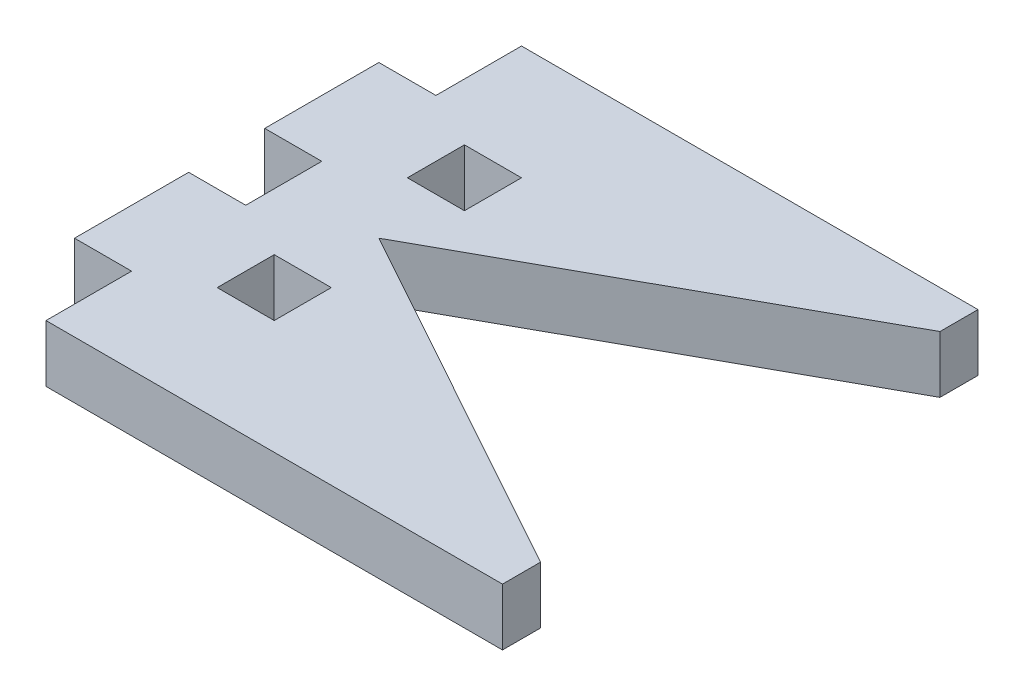
ISO-10303-21;
HEADER;
FILE_DESCRIPTION(('STEP AP214'),'2;1');
FILE_NAME('part.step','',(''),(''),'','','');
FILE_SCHEMA(('AUTOMOTIVE_DESIGN { 1 0 10303 214 1 1 1 1 }'));
ENDSEC;
DATA;
#1=APPLICATION_CONTEXT('core data for automotive mechanical design processes');
#2=APPLICATION_PROTOCOL_DEFINITION('international standard','automotive_design',2000,#1);
#3=PRODUCT_CONTEXT('',#1,'mechanical');
#4=PRODUCT('Part','Part','',(#3));
#5=PRODUCT_RELATED_PRODUCT_CATEGORY('part','',(#4));
#6=PRODUCT_DEFINITION_FORMATION('','',#4);
#7=PRODUCT_DEFINITION_CONTEXT('part definition',#1,'design');
#8=PRODUCT_DEFINITION('design','',#6,#7);
#9=PRODUCT_DEFINITION_SHAPE('','',#8);
#10=(LENGTH_UNIT() NAMED_UNIT(*) SI_UNIT(.MILLI.,.METRE.));
#11=(NAMED_UNIT(*) PLANE_ANGLE_UNIT() SI_UNIT($,.RADIAN.));
#12=(NAMED_UNIT(*) SI_UNIT($,.STERADIAN.) SOLID_ANGLE_UNIT());
#13=UNCERTAINTY_MEASURE_WITH_UNIT(LENGTH_MEASURE(1.E-05),#10,'distance_accuracy_value','');
#14=(GEOMETRIC_REPRESENTATION_CONTEXT(3) GLOBAL_UNCERTAINTY_ASSIGNED_CONTEXT((#13)) GLOBAL_UNIT_ASSIGNED_CONTEXT((#10,
#11,#12)) REPRESENTATION_CONTEXT('',''));
#15=CARTESIAN_POINT('',(0.,0.,0.));
#16=DIRECTION('',(0.,0.,1.));
#17=DIRECTION('',(1.,0.,0.));
#18=AXIS2_PLACEMENT_3D('',#15,#16,#17);
#19=CARTESIAN_POINT('',(13.5,3.,10.5));
#20=DIRECTION('',(-1.,0.,0.));
#21=DIRECTION('',(0.,0.,1.));
#22=AXIS2_PLACEMENT_3D('',#19,#20,#21);
#23=PLANE('',#22);
#24=DIRECTION('',(0.,0.,-1.));
#25=VECTOR('',#24,1.);
#26=CARTESIAN_POINT('',(13.5,0.,10.5));
#27=LINE('',#26,#25);
#28=CARTESIAN_POINT('',(13.5,0.,12.5));
#29=VERTEX_POINT('',#28);
#30=CARTESIAN_POINT('',(13.5,0.,10.5));
#31=VERTEX_POINT('',#30);
#32=EDGE_CURVE('E249',#29,#31,#27,.T.);
#33=ORIENTED_EDGE('',*,*,#32,.T.);
#34=DIRECTION('',(0.,-1.,0.));
#35=VECTOR('',#34,1.);
#36=CARTESIAN_POINT('',(13.5,3.,10.5));
#37=LINE('',#36,#35);
#38=CARTESIAN_POINT('',(13.5,3.,10.5));
#39=VERTEX_POINT('',#38);
#40=EDGE_CURVE('E11',#39,#31,#37,.T.);
#41=ORIENTED_EDGE('',*,*,#40,.F.);
#42=DIRECTION('',(0.,0.,-1.));
#43=VECTOR('',#42,1.);
#44=CARTESIAN_POINT('',(13.5,3.,10.5));
#45=LINE('',#44,#43);
#46=CARTESIAN_POINT('',(13.5,3.,12.5));
#47=VERTEX_POINT('',#46);
#48=EDGE_CURVE('E256',#47,#39,#45,.T.);
#49=ORIENTED_EDGE('',*,*,#48,.F.);
#50=DIRECTION('',(0.,-1.,0.));
#51=VECTOR('',#50,1.);
#52=CARTESIAN_POINT('',(13.5,3.,12.5));
#53=LINE('',#52,#51);
#54=EDGE_CURVE('E288',#47,#29,#53,.T.);
#55=ORIENTED_EDGE('',*,*,#54,.T.);
#56=EDGE_LOOP('',(#33,#41,#49,#55));
#57=FACE_BOUND('',#56,.T.);
#58=ADVANCED_FACE('F33',(#57),#23,.F.);
#59=CARTESIAN_POINT('',(-5.5,3.,0.));
#60=DIRECTION('',(-0.483686111690123,0.,0.87524153543927));
#61=DIRECTION('',(0.87524153543927,0.,0.483686111690123));
#62=AXIS2_PLACEMENT_3D('',#59,#60,#61);
#63=PLANE('',#62);
#64=DIRECTION('',(-0.87524153543927,0.,-0.483686111690123));
#65=VECTOR('',#64,1.);
#66=CARTESIAN_POINT('',(-5.5,0.,0.));
#67=LINE('',#66,#65);
#68=CARTESIAN_POINT('',(-5.5,0.,0.));
#69=VERTEX_POINT('',#68);
#70=EDGE_CURVE('E291',#31,#69,#67,.T.);
#71=ORIENTED_EDGE('',*,*,#70,.T.);
#72=DIRECTION('',(0.,-1.,0.));
#73=VECTOR('',#72,1.);
#74=CARTESIAN_POINT('',(-5.5,3.,0.));
#75=LINE('',#74,#73);
#76=CARTESIAN_POINT('',(-5.5,3.,0.));
#77=VERTEX_POINT('',#76);
#78=EDGE_CURVE('E40',#77,#69,#75,.T.);
#79=ORIENTED_EDGE('',*,*,#78,.F.);
#80=DIRECTION('',(-0.87524153543927,0.,-0.483686111690123));
#81=VECTOR('',#80,1.);
#82=CARTESIAN_POINT('',(-5.5,3.,0.));
#83=LINE('',#82,#81);
#84=EDGE_CURVE('E259',#39,#77,#83,.T.);
#85=ORIENTED_EDGE('',*,*,#84,.F.);
#86=ORIENTED_EDGE('',*,*,#40,.T.);
#87=EDGE_LOOP('',(#71,#79,#85,#86));
#88=FACE_BOUND('',#87,.T.);
#89=ADVANCED_FACE('F382',(#88),#63,.F.);
#90=CARTESIAN_POINT('',(-5.5,3.,0.));
#91=DIRECTION('',(-0.483686111690123,0.,-0.875241535439269));
#92=DIRECTION('',(-0.875241535439269,0.,0.483686111690123));
#93=AXIS2_PLACEMENT_3D('',#90,#91,#92);
#94=PLANE('',#93);
#95=DIRECTION('',(0.875241535439269,0.,-0.483686111690123));
#96=VECTOR('',#95,1.);
#97=CARTESIAN_POINT('',(-5.5,0.,0.));
#98=LINE('',#97,#96);
#99=CARTESIAN_POINT('',(13.5,0.,-10.5));
#100=VERTEX_POINT('',#99);
#101=EDGE_CURVE('E293',#69,#100,#98,.T.);
#102=ORIENTED_EDGE('',*,*,#101,.T.);
#103=DIRECTION('',(0.,-1.,0.));
#104=VECTOR('',#103,1.);
#105=CARTESIAN_POINT('',(13.5,3.,-10.5));
#106=LINE('',#105,#104);
#107=CARTESIAN_POINT('',(13.5,3.,-10.5));
#108=VERTEX_POINT('',#107);
#109=EDGE_CURVE('E353',#108,#100,#106,.T.);
#110=ORIENTED_EDGE('',*,*,#109,.F.);
#111=DIRECTION('',(0.875241535439269,0.,-0.483686111690123));
#112=VECTOR('',#111,1.);
#113=CARTESIAN_POINT('',(-5.5,3.,0.));
#114=LINE('',#113,#112);
#115=EDGE_CURVE('E262',#77,#108,#114,.T.);
#116=ORIENTED_EDGE('',*,*,#115,.F.);
#117=ORIENTED_EDGE('',*,*,#78,.T.);
#118=EDGE_LOOP('',(#102,#110,#116,#117));
#119=FACE_BOUND('',#118,.T.);
#120=ADVANCED_FACE('F360',(#119),#94,.F.);
#121=CARTESIAN_POINT('',(13.5,3.,-12.5));
#122=DIRECTION('',(-1.,0.,0.));
#123=DIRECTION('',(0.,0.,1.));
#124=AXIS2_PLACEMENT_3D('',#121,#122,#123);
#125=PLANE('',#124);
#126=DIRECTION('',(0.,0.,-1.));
#127=VECTOR('',#126,1.);
#128=CARTESIAN_POINT('',(13.5,0.,-12.5));
#129=LINE('',#128,#127);
#130=CARTESIAN_POINT('',(13.5,0.,-12.5));
#131=VERTEX_POINT('',#130);
#132=EDGE_CURVE('E295',#100,#131,#129,.T.);
#133=ORIENTED_EDGE('',*,*,#132,.T.);
#134=DIRECTION('',(0.,-1.,0.));
#135=VECTOR('',#134,1.);
#136=CARTESIAN_POINT('',(13.5,3.,-12.5));
#137=LINE('',#136,#135);
#138=CARTESIAN_POINT('',(13.5,3.,-12.5));
#139=VERTEX_POINT('',#138);
#140=EDGE_CURVE('E350',#139,#131,#137,.T.);
#141=ORIENTED_EDGE('',*,*,#140,.F.);
#142=DIRECTION('',(0.,0.,-1.));
#143=VECTOR('',#142,1.);
#144=CARTESIAN_POINT('',(13.5,3.,-12.5));
#145=LINE('',#144,#143);
#146=EDGE_CURVE('E264',#108,#139,#145,.T.);
#147=ORIENTED_EDGE('',*,*,#146,.F.);
#148=ORIENTED_EDGE('',*,*,#109,.T.);
#149=EDGE_LOOP('',(#133,#141,#147,#148));
#150=FACE_BOUND('',#149,.T.);
#151=ADVANCED_FACE('F370',(#150),#125,.F.);
#152=CARTESIAN_POINT('',(-10.5,3.,-12.5));
#153=DIRECTION('',(0.,0.,1.));
#154=DIRECTION('',(1.,0.,0.));
#155=AXIS2_PLACEMENT_3D('',#152,#153,#154);
#156=PLANE('',#155);
#157=DIRECTION('',(-1.,0.,0.));
#158=VECTOR('',#157,1.);
#159=CARTESIAN_POINT('',(-10.5,0.,-12.5));
#160=LINE('',#159,#158);
#161=CARTESIAN_POINT('',(-10.5,0.,-12.5));
#162=VERTEX_POINT('',#161);
#163=EDGE_CURVE('E297',#131,#162,#160,.T.);
#164=ORIENTED_EDGE('',*,*,#163,.T.);
#165=DIRECTION('',(0.,-1.,0.));
#166=VECTOR('',#165,1.);
#167=CARTESIAN_POINT('',(-10.5,3.,-12.5));
#168=LINE('',#167,#166);
#169=CARTESIAN_POINT('',(-10.5,3.,-12.5));
#170=VERTEX_POINT('',#169);
#171=EDGE_CURVE('E347',#170,#162,#168,.T.);
#172=ORIENTED_EDGE('',*,*,#171,.F.);
#173=DIRECTION('',(-1.,0.,0.));
#174=VECTOR('',#173,1.);
#175=CARTESIAN_POINT('',(-10.5,3.,-12.5));
#176=LINE('',#175,#174);
#177=EDGE_CURVE('E266',#139,#170,#176,.T.);
#178=ORIENTED_EDGE('',*,*,#177,.F.);
#179=ORIENTED_EDGE('',*,*,#140,.T.);
#180=EDGE_LOOP('',(#164,#172,#178,#179));
#181=FACE_BOUND('',#180,.T.);
#182=ADVANCED_FACE('F374',(#181),#156,.F.);
#183=CARTESIAN_POINT('',(-10.5,3.,-8.));
#184=DIRECTION('',(1.,0.,0.));
#185=DIRECTION('',(0.,0.,-1.));
#186=AXIS2_PLACEMENT_3D('',#183,#184,#185);
#187=PLANE('',#186);
#188=DIRECTION('',(0.,0.,1.));
#189=VECTOR('',#188,1.);
#190=CARTESIAN_POINT('',(-10.5,0.,-8.));
#191=LINE('',#190,#189);
#192=CARTESIAN_POINT('',(-10.5,0.,-8.));
#193=VERTEX_POINT('',#192);
#194=EDGE_CURVE('E299',#162,#193,#191,.T.);
#195=ORIENTED_EDGE('',*,*,#194,.T.);
#196=DIRECTION('',(0.,-1.,0.));
#197=VECTOR('',#196,1.);
#198=CARTESIAN_POINT('',(-10.5,3.,-8.));
#199=LINE('',#198,#197);
#200=CARTESIAN_POINT('',(-10.5,3.,-8.));
#201=VERTEX_POINT('',#200);
#202=EDGE_CURVE('E344',#201,#193,#199,.T.);
#203=ORIENTED_EDGE('',*,*,#202,.F.);
#204=DIRECTION('',(0.,0.,1.));
#205=VECTOR('',#204,1.);
#206=CARTESIAN_POINT('',(-10.5,3.,-8.));
#207=LINE('',#206,#205);
#208=EDGE_CURVE('E268',#170,#201,#207,.T.);
#209=ORIENTED_EDGE('',*,*,#208,.F.);
#210=ORIENTED_EDGE('',*,*,#171,.T.);
#211=EDGE_LOOP('',(#195,#203,#209,#210));
#212=FACE_BOUND('',#211,.T.);
#213=ADVANCED_FACE('F430',(#212),#187,.F.);
#214=CARTESIAN_POINT('',(-13.5,3.,-8.));
#215=DIRECTION('',(0.,0.,1.));
#216=DIRECTION('',(1.,0.,0.));
#217=AXIS2_PLACEMENT_3D('',#214,#215,#216);
#218=PLANE('',#217);
#219=DIRECTION('',(-1.,0.,0.));
#220=VECTOR('',#219,1.);
#221=CARTESIAN_POINT('',(-13.5,0.,-8.));
#222=LINE('',#221,#220);
#223=CARTESIAN_POINT('',(-13.5,0.,-8.));
#224=VERTEX_POINT('',#223);
#225=EDGE_CURVE('E301',#193,#224,#222,.T.);
#226=ORIENTED_EDGE('',*,*,#225,.T.);
#227=DIRECTION('',(0.,-1.,0.));
#228=VECTOR('',#227,1.);
#229=CARTESIAN_POINT('',(-13.5,3.,-8.));
#230=LINE('',#229,#228);
#231=CARTESIAN_POINT('',(-13.5,3.,-8.));
#232=VERTEX_POINT('',#231);
#233=EDGE_CURVE('E341',#232,#224,#230,.T.);
#234=ORIENTED_EDGE('',*,*,#233,.F.);
#235=DIRECTION('',(-1.,0.,0.));
#236=VECTOR('',#235,1.);
#237=CARTESIAN_POINT('',(-13.5,3.,-8.));
#238=LINE('',#237,#236);
#239=EDGE_CURVE('E270',#201,#232,#238,.T.);
#240=ORIENTED_EDGE('',*,*,#239,.F.);
#241=ORIENTED_EDGE('',*,*,#202,.T.);
#242=EDGE_LOOP('',(#226,#234,#240,#241));
#243=FACE_BOUND('',#242,.T.);
#244=ADVANCED_FACE('F428',(#243),#218,.F.);
#245=CARTESIAN_POINT('',(-13.5,3.,-8.));
#246=DIRECTION('',(1.,0.,0.));
#247=DIRECTION('',(0.,0.,-1.));
#248=AXIS2_PLACEMENT_3D('',#245,#246,#247);
#249=PLANE('',#248);
#250=DIRECTION('',(0.,0.,1.));
#251=VECTOR('',#250,1.);
#252=CARTESIAN_POINT('',(-13.5,0.,-8.));
#253=LINE('',#252,#251);
#254=CARTESIAN_POINT('',(-13.5,0.,-2.));
#255=VERTEX_POINT('',#254);
#256=EDGE_CURVE('E303',#224,#255,#253,.T.);
#257=ORIENTED_EDGE('',*,*,#256,.T.);
#258=DIRECTION('',(0.,-1.,0.));
#259=VECTOR('',#258,1.);
#260=CARTESIAN_POINT('',(-13.5,3.,-2.));
#261=LINE('',#260,#259);
#262=CARTESIAN_POINT('',(-13.5,3.,-2.));
#263=VERTEX_POINT('',#262);
#264=EDGE_CURVE('E338',#263,#255,#261,.T.);
#265=ORIENTED_EDGE('',*,*,#264,.F.);
#266=DIRECTION('',(0.,0.,1.));
#267=VECTOR('',#266,1.);
#268=CARTESIAN_POINT('',(-13.5,3.,-8.));
#269=LINE('',#268,#267);
#270=EDGE_CURVE('E272',#232,#263,#269,.T.);
#271=ORIENTED_EDGE('',*,*,#270,.F.);
#272=ORIENTED_EDGE('',*,*,#233,.T.);
#273=EDGE_LOOP('',(#257,#265,#271,#272));
#274=FACE_BOUND('',#273,.T.);
#275=ADVANCED_FACE('F424',(#274),#249,.F.);
#276=CARTESIAN_POINT('',(-13.5,3.,-2.));
#277=DIRECTION('',(0.,0.,-1.));
#278=DIRECTION('',(-1.,0.,0.));
#279=AXIS2_PLACEMENT_3D('',#276,#277,#278);
#280=PLANE('',#279);
#281=DIRECTION('',(1.,0.,0.));
#282=VECTOR('',#281,1.);
#283=CARTESIAN_POINT('',(-13.5,0.,-2.));
#284=LINE('',#283,#282);
#285=CARTESIAN_POINT('',(-10.5,0.,-2.));
#286=VERTEX_POINT('',#285);
#287=EDGE_CURVE('E305',#255,#286,#284,.T.);
#288=ORIENTED_EDGE('',*,*,#287,.T.);
#289=DIRECTION('',(0.,-1.,0.));
#290=VECTOR('',#289,1.);
#291=CARTESIAN_POINT('',(-10.5,3.,-2.));
#292=LINE('',#291,#290);
#293=CARTESIAN_POINT('',(-10.5,3.,-2.));
#294=VERTEX_POINT('',#293);
#295=EDGE_CURVE('E335',#294,#286,#292,.T.);
#296=ORIENTED_EDGE('',*,*,#295,.F.);
#297=DIRECTION('',(1.,0.,0.));
#298=VECTOR('',#297,1.);
#299=CARTESIAN_POINT('',(-13.5,3.,-2.));
#300=LINE('',#299,#298);
#301=EDGE_CURVE('E274',#263,#294,#300,.T.);
#302=ORIENTED_EDGE('',*,*,#301,.F.);
#303=ORIENTED_EDGE('',*,*,#264,.T.);
#304=EDGE_LOOP('',(#288,#296,#302,#303));
#305=FACE_BOUND('',#304,.T.);
#306=ADVANCED_FACE('F419',(#305),#280,.F.);
#307=CARTESIAN_POINT('',(-10.5,3.,-2.));
#308=DIRECTION('',(1.,0.,0.));
#309=DIRECTION('',(0.,0.,-1.));
#310=AXIS2_PLACEMENT_3D('',#307,#308,#309);
#311=PLANE('',#310);
#312=DIRECTION('',(0.,0.,1.));
#313=VECTOR('',#312,1.);
#314=CARTESIAN_POINT('',(-10.5,0.,-2.));
#315=LINE('',#314,#313);
#316=CARTESIAN_POINT('',(-10.5,0.,2.));
#317=VERTEX_POINT('',#316);
#318=EDGE_CURVE('E307',#286,#317,#315,.T.);
#319=ORIENTED_EDGE('',*,*,#318,.T.);
#320=DIRECTION('',(0.,-1.,0.));
#321=VECTOR('',#320,1.);
#322=CARTESIAN_POINT('',(-10.5,3.,2.));
#323=LINE('',#322,#321);
#324=CARTESIAN_POINT('',(-10.5,3.,2.));
#325=VERTEX_POINT('',#324);
#326=EDGE_CURVE('E332',#325,#317,#323,.T.);
#327=ORIENTED_EDGE('',*,*,#326,.F.);
#328=DIRECTION('',(0.,0.,1.));
#329=VECTOR('',#328,1.);
#330=CARTESIAN_POINT('',(-10.5,3.,-2.));
#331=LINE('',#330,#329);
#332=EDGE_CURVE('E276',#294,#325,#331,.T.);
#333=ORIENTED_EDGE('',*,*,#332,.F.);
#334=ORIENTED_EDGE('',*,*,#295,.T.);
#335=EDGE_LOOP('',(#319,#327,#333,#334));
#336=FACE_BOUND('',#335,.T.);
#337=ADVANCED_FACE('F413',(#336),#311,.F.);
#338=CARTESIAN_POINT('',(-13.5,3.,2.));
#339=DIRECTION('',(0.,0.,1.));
#340=DIRECTION('',(1.,0.,0.));
#341=AXIS2_PLACEMENT_3D('',#338,#339,#340);
#342=PLANE('',#341);
#343=DIRECTION('',(-1.,0.,0.));
#344=VECTOR('',#343,1.);
#345=CARTESIAN_POINT('',(-13.5,0.,2.));
#346=LINE('',#345,#344);
#347=CARTESIAN_POINT('',(-13.5,0.,2.));
#348=VERTEX_POINT('',#347);
#349=EDGE_CURVE('E309',#317,#348,#346,.T.);
#350=ORIENTED_EDGE('',*,*,#349,.T.);
#351=DIRECTION('',(0.,-1.,0.));
#352=VECTOR('',#351,1.);
#353=CARTESIAN_POINT('',(-13.5,3.,2.));
#354=LINE('',#353,#352);
#355=CARTESIAN_POINT('',(-13.5,3.,2.));
#356=VERTEX_POINT('',#355);
#357=EDGE_CURVE('E329',#356,#348,#354,.T.);
#358=ORIENTED_EDGE('',*,*,#357,.F.);
#359=DIRECTION('',(-1.,0.,0.));
#360=VECTOR('',#359,1.);
#361=CARTESIAN_POINT('',(-13.5,3.,2.));
#362=LINE('',#361,#360);
#363=EDGE_CURVE('E278',#325,#356,#362,.T.);
#364=ORIENTED_EDGE('',*,*,#363,.F.);
#365=ORIENTED_EDGE('',*,*,#326,.T.);
#366=EDGE_LOOP('',(#350,#358,#364,#365));
#367=FACE_BOUND('',#366,.T.);
#368=ADVANCED_FACE('F409',(#367),#342,.F.);
#369=CARTESIAN_POINT('',(-13.5,3.,2.));
#370=DIRECTION('',(1.,0.,0.));
#371=DIRECTION('',(0.,0.,-1.));
#372=AXIS2_PLACEMENT_3D('',#369,#370,#371);
#373=PLANE('',#372);
#374=DIRECTION('',(0.,0.,1.));
#375=VECTOR('',#374,1.);
#376=CARTESIAN_POINT('',(-13.5,0.,2.));
#377=LINE('',#376,#375);
#378=CARTESIAN_POINT('',(-13.5,0.,8.));
#379=VERTEX_POINT('',#378);
#380=EDGE_CURVE('E311',#348,#379,#377,.T.);
#381=ORIENTED_EDGE('',*,*,#380,.T.);
#382=DIRECTION('',(0.,-1.,0.));
#383=VECTOR('',#382,1.);
#384=CARTESIAN_POINT('',(-13.5,3.,8.));
#385=LINE('',#384,#383);
#386=CARTESIAN_POINT('',(-13.5,3.,8.));
#387=VERTEX_POINT('',#386);
#388=EDGE_CURVE('E326',#387,#379,#385,.T.);
#389=ORIENTED_EDGE('',*,*,#388,.F.);
#390=DIRECTION('',(0.,0.,1.));
#391=VECTOR('',#390,1.);
#392=CARTESIAN_POINT('',(-13.5,3.,2.));
#393=LINE('',#392,#391);
#394=EDGE_CURVE('E280',#356,#387,#393,.T.);
#395=ORIENTED_EDGE('',*,*,#394,.F.);
#396=ORIENTED_EDGE('',*,*,#357,.T.);
#397=EDGE_LOOP('',(#381,#389,#395,#396));
#398=FACE_BOUND('',#397,.T.);
#399=ADVANCED_FACE('F404',(#398),#373,.F.);
#400=CARTESIAN_POINT('',(-13.5,3.,8.));
#401=DIRECTION('',(0.,0.,-1.));
#402=DIRECTION('',(-1.,0.,0.));
#403=AXIS2_PLACEMENT_3D('',#400,#401,#402);
#404=PLANE('',#403);
#405=DIRECTION('',(1.,0.,0.));
#406=VECTOR('',#405,1.);
#407=CARTESIAN_POINT('',(-13.5,0.,8.));
#408=LINE('',#407,#406);
#409=CARTESIAN_POINT('',(-10.5,0.,8.));
#410=VERTEX_POINT('',#409);
#411=EDGE_CURVE('E313',#379,#410,#408,.T.);
#412=ORIENTED_EDGE('',*,*,#411,.T.);
#413=DIRECTION('',(0.,-1.,0.));
#414=VECTOR('',#413,1.);
#415=CARTESIAN_POINT('',(-10.5,3.,8.));
#416=LINE('',#415,#414);
#417=CARTESIAN_POINT('',(-10.5,3.,8.));
#418=VERTEX_POINT('',#417);
#419=EDGE_CURVE('E323',#418,#410,#416,.T.);
#420=ORIENTED_EDGE('',*,*,#419,.F.);
#421=DIRECTION('',(1.,0.,0.));
#422=VECTOR('',#421,1.);
#423=CARTESIAN_POINT('',(-13.5,3.,8.));
#424=LINE('',#423,#422);
#425=EDGE_CURVE('E282',#387,#418,#424,.T.);
#426=ORIENTED_EDGE('',*,*,#425,.F.);
#427=ORIENTED_EDGE('',*,*,#388,.T.);
#428=EDGE_LOOP('',(#412,#420,#426,#427));
#429=FACE_BOUND('',#428,.T.);
#430=ADVANCED_FACE('F398',(#429),#404,.F.);
#431=CARTESIAN_POINT('',(-10.5,3.,8.));
#432=DIRECTION('',(1.,0.,0.));
#433=DIRECTION('',(0.,0.,-1.));
#434=AXIS2_PLACEMENT_3D('',#431,#432,#433);
#435=PLANE('',#434);
#436=DIRECTION('',(0.,0.,1.));
#437=VECTOR('',#436,1.);
#438=CARTESIAN_POINT('',(-10.5,0.,8.));
#439=LINE('',#438,#437);
#440=CARTESIAN_POINT('',(-10.5,0.,12.5));
#441=VERTEX_POINT('',#440);
#442=EDGE_CURVE('E315',#410,#441,#439,.T.);
#443=ORIENTED_EDGE('',*,*,#442,.T.);
#444=DIRECTION('',(0.,-1.,0.));
#445=VECTOR('',#444,1.);
#446=CARTESIAN_POINT('',(-10.5,3.,12.5));
#447=LINE('',#446,#445);
#448=CARTESIAN_POINT('',(-10.5,3.,12.5));
#449=VERTEX_POINT('',#448);
#450=EDGE_CURVE('E320',#449,#441,#447,.T.);
#451=ORIENTED_EDGE('',*,*,#450,.F.);
#452=DIRECTION('',(0.,0.,1.));
#453=VECTOR('',#452,1.);
#454=CARTESIAN_POINT('',(-10.5,3.,8.));
#455=LINE('',#454,#453);
#456=EDGE_CURVE('E284',#418,#449,#455,.T.);
#457=ORIENTED_EDGE('',*,*,#456,.F.);
#458=ORIENTED_EDGE('',*,*,#419,.T.);
#459=EDGE_LOOP('',(#443,#451,#457,#458));
#460=FACE_BOUND('',#459,.T.);
#461=ADVANCED_FACE('F394',(#460),#435,.F.);
#462=CARTESIAN_POINT('',(-10.5,3.,12.5));
#463=DIRECTION('',(0.,0.,-1.));
#464=DIRECTION('',(-1.,0.,0.));
#465=AXIS2_PLACEMENT_3D('',#462,#463,#464);
#466=PLANE('',#465);
#467=DIRECTION('',(1.,0.,0.));
#468=VECTOR('',#467,1.);
#469=CARTESIAN_POINT('',(-10.5,0.,12.5));
#470=LINE('',#469,#468);
#471=EDGE_CURVE('E260',#441,#29,#470,.T.);
#472=ORIENTED_EDGE('',*,*,#471,.T.);
#473=ORIENTED_EDGE('',*,*,#54,.F.);
#474=DIRECTION('',(1.,0.,0.));
#475=VECTOR('',#474,1.);
#476=CARTESIAN_POINT('',(-10.5,3.,12.5));
#477=LINE('',#476,#475);
#478=EDGE_CURVE('E286',#449,#47,#477,.T.);
#479=ORIENTED_EDGE('',*,*,#478,.F.);
#480=ORIENTED_EDGE('',*,*,#450,.T.);
#481=EDGE_LOOP('',(#472,#473,#479,#480));
#482=FACE_BOUND('',#481,.T.);
#483=ADVANCED_FACE('F389',(#482),#466,.F.);
#484=CARTESIAN_POINT('',(0.,3.,0.));
#485=DIRECTION('',(0.,1.,0.));
#486=DIRECTION('',(0.,0.,1.));
#487=AXIS2_PLACEMENT_3D('',#484,#485,#486);
#488=PLANE('',#487);
#489=DIRECTION('',(-1.,0.,0.));
#490=VECTOR('',#489,1.);
#491=CARTESIAN_POINT('',(-7.5,3.,3.50000000000001));
#492=LINE('',#491,#490);
#493=CARTESIAN_POINT('',(-4.5,3.,3.5));
#494=VERTEX_POINT('',#493);
#495=CARTESIAN_POINT('',(-7.5,3.,3.50000000000001));
#496=VERTEX_POINT('',#495);
#497=EDGE_CURVE('E47',#494,#496,#492,.T.);
#498=ORIENTED_EDGE('',*,*,#497,.F.);
#499=DIRECTION('',(0.,0.,-1.));
#500=VECTOR('',#499,1.);
#501=CARTESIAN_POINT('',(-4.5,3.,3.5));
#502=LINE('',#501,#500);
#503=CARTESIAN_POINT('',(-4.5,3.,6.5));
#504=VERTEX_POINT('',#503);
#505=EDGE_CURVE('E205',#504,#494,#502,.T.);
#506=ORIENTED_EDGE('',*,*,#505,.F.);
#507=DIRECTION('',(1.,0.,0.));
#508=VECTOR('',#507,1.);
#509=CARTESIAN_POINT('',(-7.5,3.,6.50000000000001));
#510=LINE('',#509,#508);
#511=CARTESIAN_POINT('',(-7.5,3.,6.50000000000001));
#512=VERTEX_POINT('',#511);
#513=EDGE_CURVE('E208',#512,#504,#510,.T.);
#514=ORIENTED_EDGE('',*,*,#513,.F.);
#515=DIRECTION('',(0.,0.,1.));
#516=VECTOR('',#515,1.);
#517=CARTESIAN_POINT('',(-7.5,3.,3.50000000000001));
#518=LINE('',#517,#516);
#519=EDGE_CURVE('E214',#496,#512,#518,.T.);
#520=ORIENTED_EDGE('',*,*,#519,.F.);
#521=EDGE_LOOP('',(#498,#506,#514,#520));
#522=FACE_BOUND('',#521,.T.);
#523=DIRECTION('',(-1.,0.,0.));
#524=VECTOR('',#523,1.);
#525=CARTESIAN_POINT('',(-7.5,3.,-6.5));
#526=LINE('',#525,#524);
#527=CARTESIAN_POINT('',(-4.5,3.,-6.50000000000001));
#528=VERTEX_POINT('',#527);
#529=CARTESIAN_POINT('',(-7.5,3.,-6.5));
#530=VERTEX_POINT('',#529);
#531=EDGE_CURVE('E220',#528,#530,#526,.T.);
#532=ORIENTED_EDGE('',*,*,#531,.F.);
#533=DIRECTION('',(0.,0.,-1.));
#534=VECTOR('',#533,1.);
#535=CARTESIAN_POINT('',(-4.5,3.,-6.50000000000001));
#536=LINE('',#535,#534);
#537=CARTESIAN_POINT('',(-4.5,3.,-3.50000000000001));
#538=VERTEX_POINT('',#537);
#539=EDGE_CURVE('E228',#538,#528,#536,.T.);
#540=ORIENTED_EDGE('',*,*,#539,.F.);
#541=DIRECTION('',(1.,0.,0.));
#542=VECTOR('',#541,1.);
#543=CARTESIAN_POINT('',(-7.5,3.,-3.50000000000001));
#544=LINE('',#543,#542);
#545=CARTESIAN_POINT('',(-7.5,3.,-3.50000000000001));
#546=VERTEX_POINT('',#545);
#547=EDGE_CURVE('E242',#546,#538,#544,.T.);
#548=ORIENTED_EDGE('',*,*,#547,.F.);
#549=DIRECTION('',(0.,0.,1.));
#550=VECTOR('',#549,1.);
#551=CARTESIAN_POINT('',(-7.5,3.,-6.5));
#552=LINE('',#551,#550);
#553=EDGE_CURVE('E239',#530,#546,#552,.T.);
#554=ORIENTED_EDGE('',*,*,#553,.F.);
#555=EDGE_LOOP('',(#532,#540,#548,#554));
#556=FACE_BOUND('',#555,.T.);
#557=ORIENTED_EDGE('',*,*,#48,.T.);
#558=ORIENTED_EDGE('',*,*,#84,.T.);
#559=ORIENTED_EDGE('',*,*,#115,.T.);
#560=ORIENTED_EDGE('',*,*,#146,.T.);
#561=ORIENTED_EDGE('',*,*,#177,.T.);
#562=ORIENTED_EDGE('',*,*,#208,.T.);
#563=ORIENTED_EDGE('',*,*,#239,.T.);
#564=ORIENTED_EDGE('',*,*,#270,.T.);
#565=ORIENTED_EDGE('',*,*,#301,.T.);
#566=ORIENTED_EDGE('',*,*,#332,.T.);
#567=ORIENTED_EDGE('',*,*,#363,.T.);
#568=ORIENTED_EDGE('',*,*,#394,.T.);
#569=ORIENTED_EDGE('',*,*,#425,.T.);
#570=ORIENTED_EDGE('',*,*,#456,.T.);
#571=ORIENTED_EDGE('',*,*,#478,.T.);
#572=EDGE_LOOP('',(#557,#558,#559,#560,#561,#562,#563,#564,#565,#566,#567,#568,#569,#570,#571));
#573=FACE_BOUND('',#572,.T.);
#574=ADVANCED_FACE('F378',(#522,#556,#573),#488,.T.);
#575=CARTESIAN_POINT('',(0.,0.,0.));
#576=DIRECTION('',(0.,1.,0.));
#577=DIRECTION('',(0.,0.,1.));
#578=AXIS2_PLACEMENT_3D('',#575,#576,#577);
#579=PLANE('',#578);
#580=DIRECTION('',(0.,0.,-1.));
#581=VECTOR('',#580,1.);
#582=CARTESIAN_POINT('',(-4.5,0.,3.5));
#583=LINE('',#582,#581);
#584=CARTESIAN_POINT('',(-4.5,0.,6.5));
#585=VERTEX_POINT('',#584);
#586=CARTESIAN_POINT('',(-4.5,0.,3.5));
#587=VERTEX_POINT('',#586);
#588=EDGE_CURVE('E195',#585,#587,#583,.T.);
#589=ORIENTED_EDGE('',*,*,#588,.T.);
#590=DIRECTION('',(-1.,0.,0.));
#591=VECTOR('',#590,1.);
#592=CARTESIAN_POINT('',(-7.5,0.,3.50000000000001));
#593=LINE('',#592,#591);
#594=CARTESIAN_POINT('',(-7.5,0.,3.50000000000001));
#595=VERTEX_POINT('',#594);
#596=EDGE_CURVE('E189',#587,#595,#593,.T.);
#597=ORIENTED_EDGE('',*,*,#596,.T.);
#598=DIRECTION('',(0.,0.,1.));
#599=VECTOR('',#598,1.);
#600=CARTESIAN_POINT('',(-7.5,0.,3.50000000000001));
#601=LINE('',#600,#599);
#602=CARTESIAN_POINT('',(-7.5,0.,6.5));
#603=VERTEX_POINT('',#602);
#604=EDGE_CURVE('E198',#595,#603,#601,.T.);
#605=ORIENTED_EDGE('',*,*,#604,.T.);
#606=DIRECTION('',(1.,0.,0.));
#607=VECTOR('',#606,1.);
#608=CARTESIAN_POINT('',(-7.5,0.,6.50000000000001));
#609=LINE('',#608,#607);
#610=EDGE_CURVE('E55',#603,#585,#609,.T.);
#611=ORIENTED_EDGE('',*,*,#610,.T.);
#612=EDGE_LOOP('',(#589,#597,#605,#611));
#613=FACE_BOUND('',#612,.T.);
#614=DIRECTION('',(0.,0.,-1.));
#615=VECTOR('',#614,1.);
#616=CARTESIAN_POINT('',(-4.5,0.,-6.50000000000001));
#617=LINE('',#616,#615);
#618=CARTESIAN_POINT('',(-4.5,0.,-3.50000000000001));
#619=VERTEX_POINT('',#618);
#620=CARTESIAN_POINT('',(-4.5,0.,-6.50000000000001));
#621=VERTEX_POINT('',#620);
#622=EDGE_CURVE('E234',#619,#621,#617,.T.);
#623=ORIENTED_EDGE('',*,*,#622,.T.);
#624=DIRECTION('',(-1.,0.,0.));
#625=VECTOR('',#624,1.);
#626=CARTESIAN_POINT('',(-7.5,0.,-6.5));
#627=LINE('',#626,#625);
#628=CARTESIAN_POINT('',(-7.5,0.,-6.5));
#629=VERTEX_POINT('',#628);
#630=EDGE_CURVE('E224',#621,#629,#627,.T.);
#631=ORIENTED_EDGE('',*,*,#630,.T.);
#632=DIRECTION('',(0.,0.,1.));
#633=VECTOR('',#632,1.);
#634=CARTESIAN_POINT('',(-7.5,0.,-6.5));
#635=LINE('',#634,#633);
#636=CARTESIAN_POINT('',(-7.5,0.,-3.50000000000001));
#637=VERTEX_POINT('',#636);
#638=EDGE_CURVE('E227',#629,#637,#635,.T.);
#639=ORIENTED_EDGE('',*,*,#638,.T.);
#640=DIRECTION('',(1.,0.,0.));
#641=VECTOR('',#640,1.);
#642=CARTESIAN_POINT('',(-7.5,0.,-3.50000000000001));
#643=LINE('',#642,#641);
#644=EDGE_CURVE('E231',#637,#619,#643,.T.);
#645=ORIENTED_EDGE('',*,*,#644,.T.);
#646=EDGE_LOOP('',(#623,#631,#639,#645));
#647=FACE_BOUND('',#646,.T.);
#648=ORIENTED_EDGE('',*,*,#32,.F.);
#649=ORIENTED_EDGE('',*,*,#471,.F.);
#650=ORIENTED_EDGE('',*,*,#442,.F.);
#651=ORIENTED_EDGE('',*,*,#411,.F.);
#652=ORIENTED_EDGE('',*,*,#380,.F.);
#653=ORIENTED_EDGE('',*,*,#349,.F.);
#654=ORIENTED_EDGE('',*,*,#318,.F.);
#655=ORIENTED_EDGE('',*,*,#287,.F.);
#656=ORIENTED_EDGE('',*,*,#256,.F.);
#657=ORIENTED_EDGE('',*,*,#225,.F.);
#658=ORIENTED_EDGE('',*,*,#194,.F.);
#659=ORIENTED_EDGE('',*,*,#163,.F.);
#660=ORIENTED_EDGE('',*,*,#132,.F.);
#661=ORIENTED_EDGE('',*,*,#101,.F.);
#662=ORIENTED_EDGE('',*,*,#70,.F.);
#663=EDGE_LOOP('',(#648,#649,#650,#651,#652,#653,#654,#655,#656,#657,#658,#659,#660,#661,#662));
#664=FACE_BOUND('',#663,.T.);
#665=ADVANCED_FACE('F202',(#613,#647,#664),#579,.F.);
#666=CARTESIAN_POINT('',(-7.5,0.,-6.5));
#667=DIRECTION('',(0.,0.,-1.));
#668=DIRECTION('',(-1.,0.,0.));
#669=AXIS2_PLACEMENT_3D('',#666,#667,#668);
#670=PLANE('',#669);
#671=ORIENTED_EDGE('',*,*,#531,.T.);
#672=DIRECTION('',(0.,1.,0.));
#673=VECTOR('',#672,1.);
#674=CARTESIAN_POINT('',(-7.5,0.,-6.5));
#675=LINE('',#674,#673);
#676=EDGE_CURVE('E237',#629,#530,#675,.T.);
#677=ORIENTED_EDGE('',*,*,#676,.F.);
#678=ORIENTED_EDGE('',*,*,#630,.F.);
#679=DIRECTION('',(0.,1.,0.));
#680=VECTOR('',#679,1.);
#681=CARTESIAN_POINT('',(-4.5,0.,-6.50000000000001));
#682=LINE('',#681,#680);
#683=EDGE_CURVE('E247',#621,#528,#682,.T.);
#684=ORIENTED_EDGE('',*,*,#683,.T.);
#685=EDGE_LOOP('',(#671,#677,#678,#684));
#686=FACE_BOUND('',#685,.T.);
#687=ADVANCED_FACE('F546',(#686),#670,.F.);
#688=CARTESIAN_POINT('',(-4.5,0.,-6.50000000000001));
#689=DIRECTION('',(1.,0.,0.));
#690=DIRECTION('',(0.,0.,-1.));
#691=AXIS2_PLACEMENT_3D('',#688,#689,#690);
#692=PLANE('',#691);
#693=ORIENTED_EDGE('',*,*,#539,.T.);
#694=ORIENTED_EDGE('',*,*,#683,.F.);
#695=ORIENTED_EDGE('',*,*,#622,.F.);
#696=DIRECTION('',(0.,1.,0.));
#697=VECTOR('',#696,1.);
#698=CARTESIAN_POINT('',(-4.5,0.,-3.50000000000001));
#699=LINE('',#698,#697);
#700=EDGE_CURVE('E250',#619,#538,#699,.T.);
#701=ORIENTED_EDGE('',*,*,#700,.T.);
#702=EDGE_LOOP('',(#693,#694,#695,#701));
#703=FACE_BOUND('',#702,.T.);
#704=ADVANCED_FACE('F554',(#703),#692,.F.);
#705=CARTESIAN_POINT('',(-7.5,0.,-3.50000000000001));
#706=DIRECTION('',(0.,0.,1.));
#707=DIRECTION('',(1.,0.,0.));
#708=AXIS2_PLACEMENT_3D('',#705,#706,#707);
#709=PLANE('',#708);
#710=ORIENTED_EDGE('',*,*,#547,.T.);
#711=ORIENTED_EDGE('',*,*,#700,.F.);
#712=ORIENTED_EDGE('',*,*,#644,.F.);
#713=DIRECTION('',(0.,1.,0.));
#714=VECTOR('',#713,1.);
#715=CARTESIAN_POINT('',(-7.5,0.,-3.50000000000001));
#716=LINE('',#715,#714);
#717=EDGE_CURVE('E252',#637,#546,#716,.T.);
#718=ORIENTED_EDGE('',*,*,#717,.T.);
#719=EDGE_LOOP('',(#710,#711,#712,#718));
#720=FACE_BOUND('',#719,.T.);
#721=ADVANCED_FACE('F564',(#720),#709,.F.);
#722=CARTESIAN_POINT('',(-7.5,0.,-6.5));
#723=DIRECTION('',(-1.,0.,0.));
#724=DIRECTION('',(0.,0.,1.));
#725=AXIS2_PLACEMENT_3D('',#722,#723,#724);
#726=PLANE('',#725);
#727=ORIENTED_EDGE('',*,*,#553,.T.);
#728=ORIENTED_EDGE('',*,*,#717,.F.);
#729=ORIENTED_EDGE('',*,*,#638,.F.);
#730=ORIENTED_EDGE('',*,*,#676,.T.);
#731=EDGE_LOOP('',(#727,#728,#729,#730));
#732=FACE_BOUND('',#731,.T.);
#733=ADVANCED_FACE('F574',(#732),#726,.F.);
#734=CARTESIAN_POINT('',(-7.5,0.,3.50000000000001));
#735=DIRECTION('',(0.,0.,-1.));
#736=DIRECTION('',(-1.,0.,0.));
#737=AXIS2_PLACEMENT_3D('',#734,#735,#736);
#738=PLANE('',#737);
#739=ORIENTED_EDGE('',*,*,#497,.T.);
#740=DIRECTION('',(0.,1.,0.));
#741=VECTOR('',#740,1.);
#742=CARTESIAN_POINT('',(-7.5,0.,3.50000000000001));
#743=LINE('',#742,#741);
#744=EDGE_CURVE('E185',#595,#496,#743,.T.);
#745=ORIENTED_EDGE('',*,*,#744,.F.);
#746=ORIENTED_EDGE('',*,*,#596,.F.);
#747=DIRECTION('',(0.,1.,0.));
#748=VECTOR('',#747,1.);
#749=CARTESIAN_POINT('',(-4.5,0.,3.5));
#750=LINE('',#749,#748);
#751=EDGE_CURVE('E218',#587,#494,#750,.T.);
#752=ORIENTED_EDGE('',*,*,#751,.T.);
#753=EDGE_LOOP('',(#739,#745,#746,#752));
#754=FACE_BOUND('',#753,.T.);
#755=ADVANCED_FACE('F187',(#754),#738,.F.);
#756=CARTESIAN_POINT('',(-4.5,0.,3.5));
#757=DIRECTION('',(1.,0.,0.));
#758=DIRECTION('',(0.,0.,-1.));
#759=AXIS2_PLACEMENT_3D('',#756,#757,#758);
#760=PLANE('',#759);
#761=ORIENTED_EDGE('',*,*,#505,.T.);
#762=ORIENTED_EDGE('',*,*,#751,.F.);
#763=ORIENTED_EDGE('',*,*,#588,.F.);
#764=DIRECTION('',(0.,1.,0.));
#765=VECTOR('',#764,1.);
#766=CARTESIAN_POINT('',(-4.5,0.,6.5));
#767=LINE('',#766,#765);
#768=EDGE_CURVE('E221',#585,#504,#767,.T.);
#769=ORIENTED_EDGE('',*,*,#768,.T.);
#770=EDGE_LOOP('',(#761,#762,#763,#769));
#771=FACE_BOUND('',#770,.T.);
#772=ADVANCED_FACE('F593',(#771),#760,.F.);
#773=CARTESIAN_POINT('',(-7.5,0.,6.50000000000001));
#774=DIRECTION('',(0.,0.,1.));
#775=DIRECTION('',(1.,0.,0.));
#776=AXIS2_PLACEMENT_3D('',#773,#774,#775);
#777=PLANE('',#776);
#778=ORIENTED_EDGE('',*,*,#513,.T.);
#779=ORIENTED_EDGE('',*,*,#768,.F.);
#780=ORIENTED_EDGE('',*,*,#610,.F.);
#781=DIRECTION('',(0.,1.,0.));
#782=VECTOR('',#781,1.);
#783=CARTESIAN_POINT('',(-7.5,0.,6.50000000000001));
#784=LINE('',#783,#782);
#785=EDGE_CURVE('E194',#603,#512,#784,.T.);
#786=ORIENTED_EDGE('',*,*,#785,.T.);
#787=EDGE_LOOP('',(#778,#779,#780,#786));
#788=FACE_BOUND('',#787,.T.);
#789=ADVANCED_FACE('F602',(#788),#777,.F.);
#790=CARTESIAN_POINT('',(-7.5,0.,3.50000000000001));
#791=DIRECTION('',(-1.,0.,0.));
#792=DIRECTION('',(0.,0.,1.));
#793=AXIS2_PLACEMENT_3D('',#790,#791,#792);
#794=PLANE('',#793);
#795=ORIENTED_EDGE('',*,*,#519,.T.);
#796=ORIENTED_EDGE('',*,*,#785,.F.);
#797=ORIENTED_EDGE('',*,*,#604,.F.);
#798=ORIENTED_EDGE('',*,*,#744,.T.);
#799=EDGE_LOOP('',(#795,#796,#797,#798));
#800=FACE_BOUND('',#799,.T.);
#801=ADVANCED_FACE('F199',(#800),#794,.F.);
#802=CLOSED_SHELL('',(#58,#89,#120,#151,#182,#213,#244,#275,#306,#337,#368,#399,#430,#461,#483,
#574,#665,#687,#704,#721,#733,#755,#772,#789,#801));
#803=MANIFOLD_SOLID_BREP('B2',#802);
#804=ADVANCED_BREP_SHAPE_REPRESENTATION('',(#18,#803),#14);
#805=SHAPE_DEFINITION_REPRESENTATION(#9,#804);
ENDSEC;
END-ISO-10303-21;
